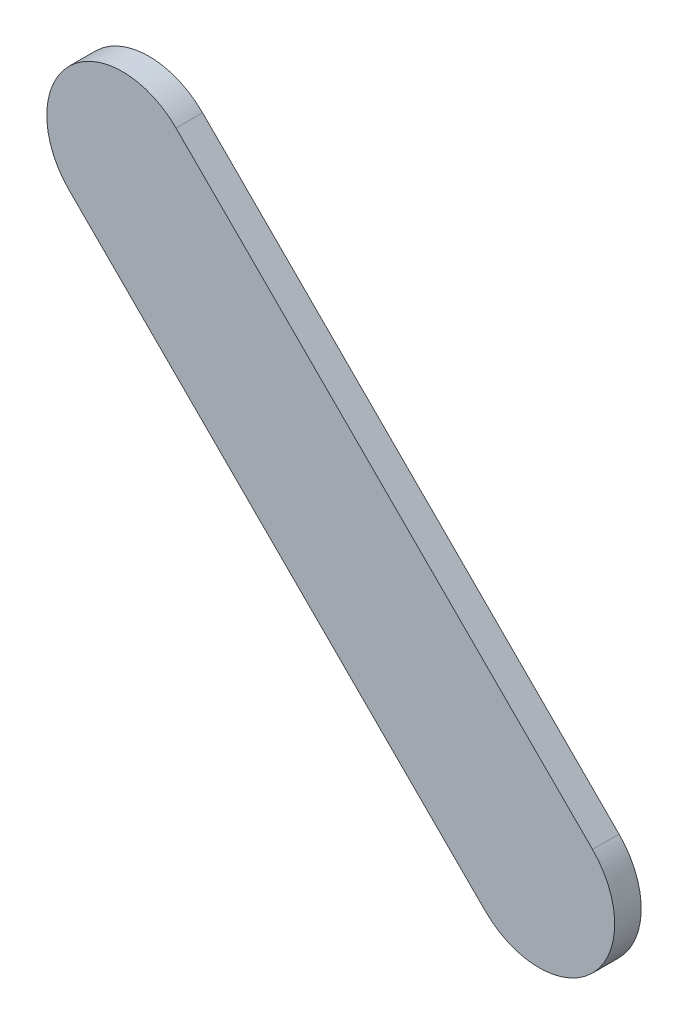
ISO-10303-21;
HEADER;
FILE_DESCRIPTION(('STEP AP214'),'2;1');
FILE_NAME('part.step','',(''),(''),'','','');
FILE_SCHEMA(('AUTOMOTIVE_DESIGN { 1 0 10303 214 1 1 1 1 }'));
ENDSEC;
DATA;
#1=APPLICATION_CONTEXT('core data for automotive mechanical design processes');
#2=APPLICATION_PROTOCOL_DEFINITION('international standard','automotive_design',2000,#1);
#3=PRODUCT_CONTEXT('',#1,'mechanical');
#4=PRODUCT('Part','Part','',(#3));
#5=PRODUCT_RELATED_PRODUCT_CATEGORY('part','',(#4));
#6=PRODUCT_DEFINITION_FORMATION('','',#4);
#7=PRODUCT_DEFINITION_CONTEXT('part definition',#1,'design');
#8=PRODUCT_DEFINITION('design','',#6,#7);
#9=PRODUCT_DEFINITION_SHAPE('','',#8);
#10=(LENGTH_UNIT() NAMED_UNIT(*) SI_UNIT(.MILLI.,.METRE.));
#11=(NAMED_UNIT(*) PLANE_ANGLE_UNIT() SI_UNIT($,.RADIAN.));
#12=(NAMED_UNIT(*) SI_UNIT($,.STERADIAN.) SOLID_ANGLE_UNIT());
#13=UNCERTAINTY_MEASURE_WITH_UNIT(LENGTH_MEASURE(1.E-05),#10,'distance_accuracy_value','');
#14=(GEOMETRIC_REPRESENTATION_CONTEXT(3) GLOBAL_UNCERTAINTY_ASSIGNED_CONTEXT((#13)) GLOBAL_UNIT_ASSIGNED_CONTEXT((#10,
#11,#12)) REPRESENTATION_CONTEXT('',''));
#15=CARTESIAN_POINT('',(0.,0.,0.));
#16=DIRECTION('',(0.,0.,1.));
#17=DIRECTION('',(1.,0.,0.));
#18=AXIS2_PLACEMENT_3D('',#15,#16,#17);
#19=CARTESIAN_POINT('',(79.579289,-119.47071,1.635));
#20=DIRECTION('',(0.,0.,1.));
#21=DIRECTION('',(1.,0.,0.));
#22=AXIS2_PLACEMENT_3D('',#19,#20,#21);
#23=PLANE('',#22);
#24=DIRECTION('',(0.707106781186548,-0.707106781186548,0.));
#25=VECTOR('',#24,1.);
#26=CARTESIAN_POINT('',(79.579289,-119.47071,1.635));
#27=LINE('',#26,#25);
#28=CARTESIAN_POINT('',(79.579289,-119.47071,1.635));
#29=VERTEX_POINT('',#28);
#30=CARTESIAN_POINT('',(80.129289,-120.02071,1.635));
#31=VERTEX_POINT('',#30);
#32=EDGE_CURVE('E77',#29,#31,#27,.T.);
#33=ORIENTED_EDGE('',*,*,#32,.T.);
#34=CARTESIAN_POINT('',(80.1999995,-119.9499995,1.635));
#35=DIRECTION('',(0.,0.,1.));
#36=DIRECTION('',(-0.707106781186048,-0.707106781187048,0.));
#37=AXIS2_PLACEMENT_3D('',#34,#35,#36);
#38=CIRCLE('',#37,0.09999974810218);
#39=CARTESIAN_POINT('',(80.27071,-119.879289,1.635));
#40=VERTEX_POINT('',#39);
#41=EDGE_CURVE('E75',#31,#40,#38,.T.);
#42=ORIENTED_EDGE('',*,*,#41,.T.);
#43=DIRECTION('',(-0.707106781186548,0.707106781186548,0.));
#44=VECTOR('',#43,1.);
#45=CARTESIAN_POINT('',(80.27071,-119.879289,1.635));
#46=LINE('',#45,#44);
#47=CARTESIAN_POINT('',(79.72071,-119.329289,1.635));
#48=VERTEX_POINT('',#47);
#49=EDGE_CURVE('E21',#40,#48,#46,.T.);
#50=ORIENTED_EDGE('',*,*,#49,.T.);
#51=CARTESIAN_POINT('',(79.6499995,-119.3999995,1.635));
#52=DIRECTION('',(0.,0.,1.));
#53=DIRECTION('',(0.707106781186048,0.707106781187048,0.));
#54=AXIS2_PLACEMENT_3D('',#51,#52,#53);
#55=CIRCLE('',#54,0.09999974810218);
#56=EDGE_CURVE('E11',#48,#29,#55,.T.);
#57=ORIENTED_EDGE('',*,*,#56,.T.);
#58=EDGE_LOOP('',(#33,#42,#50,#57));
#59=FACE_BOUND('',#58,.T.);
#60=ADVANCED_FACE('F17',(#59),#23,.T.);
#61=CARTESIAN_POINT('',(79.579289,-119.47071,1.6));
#62=DIRECTION('',(0.,0.,1.));
#63=DIRECTION('',(1.,0.,0.));
#64=AXIS2_PLACEMENT_3D('',#61,#62,#63);
#65=PLANE('',#64);
#66=CARTESIAN_POINT('',(79.6499995,-119.3999995,1.6));
#67=DIRECTION('',(0.,0.,1.));
#68=DIRECTION('',(0.707106781186048,0.707106781187048,0.));
#69=AXIS2_PLACEMENT_3D('',#66,#67,#68);
#70=CIRCLE('',#69,0.09999974810218);
#71=CARTESIAN_POINT('',(79.72071,-119.329289,1.6));
#72=VERTEX_POINT('',#71);
#73=CARTESIAN_POINT('',(79.579289,-119.47071,1.6));
#74=VERTEX_POINT('',#73);
#75=EDGE_CURVE('E28',#72,#74,#70,.T.);
#76=ORIENTED_EDGE('',*,*,#75,.F.);
#77=DIRECTION('',(-0.707106781186548,0.707106781186548,0.));
#78=VECTOR('',#77,1.);
#79=CARTESIAN_POINT('',(80.27071,-119.879289,1.6));
#80=LINE('',#79,#78);
#81=CARTESIAN_POINT('',(80.27071,-119.879289,1.6));
#82=VERTEX_POINT('',#81);
#83=EDGE_CURVE('E57',#82,#72,#80,.T.);
#84=ORIENTED_EDGE('',*,*,#83,.F.);
#85=CARTESIAN_POINT('',(80.1999995,-119.9499995,1.6));
#86=DIRECTION('',(0.,0.,1.));
#87=DIRECTION('',(-0.707106781186048,-0.707106781187048,0.));
#88=AXIS2_PLACEMENT_3D('',#85,#86,#87);
#89=CIRCLE('',#88,0.09999974810218);
#90=CARTESIAN_POINT('',(80.129289,-120.02071,1.6));
#91=VERTEX_POINT('',#90);
#92=EDGE_CURVE('E84',#91,#82,#89,.T.);
#93=ORIENTED_EDGE('',*,*,#92,.F.);
#94=DIRECTION('',(0.707106781186548,-0.707106781186548,0.));
#95=VECTOR('',#94,1.);
#96=CARTESIAN_POINT('',(79.579289,-119.47071,1.6));
#97=LINE('',#96,#95);
#98=EDGE_CURVE('E133',#74,#91,#97,.T.);
#99=ORIENTED_EDGE('',*,*,#98,.F.);
#100=EDGE_LOOP('',(#76,#84,#93,#99));
#101=FACE_BOUND('',#100,.T.);
#102=ADVANCED_FACE('F19',(#101),#65,.F.);
#103=CARTESIAN_POINT('',(79.6499995,-119.3999995,1.6));
#104=DIRECTION('',(0.,0.,-1.));
#105=DIRECTION('',(0.707106781186048,0.707106781187048,0.));
#106=AXIS2_PLACEMENT_3D('',#103,#104,#105);
#107=CYLINDRICAL_SURFACE('',#106,0.09999974810218);
#108=ORIENTED_EDGE('',*,*,#75,.T.);
#109=DIRECTION('',(0.,0.,1.));
#110=VECTOR('',#109,1.);
#111=CARTESIAN_POINT('',(79.579289,-119.47071,1.6));
#112=LINE('',#111,#110);
#113=EDGE_CURVE('E91',#74,#29,#112,.T.);
#114=ORIENTED_EDGE('',*,*,#113,.T.);
#115=ORIENTED_EDGE('',*,*,#56,.F.);
#116=DIRECTION('',(0.,0.,1.));
#117=VECTOR('',#116,1.);
#118=CARTESIAN_POINT('',(79.72071,-119.329289,1.6));
#119=LINE('',#118,#117);
#120=EDGE_CURVE('E70',#72,#48,#119,.T.);
#121=ORIENTED_EDGE('',*,*,#120,.F.);
#122=EDGE_LOOP('',(#108,#114,#115,#121));
#123=FACE_BOUND('',#122,.T.);
#124=ADVANCED_FACE('F155',(#123),#107,.T.);
#125=CARTESIAN_POINT('',(80.27071,-119.879289,1.6));
#126=DIRECTION('',(-0.707106781186548,-0.707106781186548,0.));
#127=DIRECTION('',(-0.707106781186548,0.707106781186548,0.));
#128=AXIS2_PLACEMENT_3D('',#125,#126,#127);
#129=PLANE('',#128);
#130=ORIENTED_EDGE('',*,*,#83,.T.);
#131=ORIENTED_EDGE('',*,*,#120,.T.);
#132=ORIENTED_EDGE('',*,*,#49,.F.);
#133=DIRECTION('',(0.,0.,1.));
#134=VECTOR('',#133,1.);
#135=CARTESIAN_POINT('',(80.27071,-119.879289,1.6));
#136=LINE('',#135,#134);
#137=EDGE_CURVE('E68',#82,#40,#136,.T.);
#138=ORIENTED_EDGE('',*,*,#137,.F.);
#139=EDGE_LOOP('',(#130,#131,#132,#138));
#140=FACE_BOUND('',#139,.T.);
#141=ADVANCED_FACE('F66',(#140),#129,.F.);
#142=CARTESIAN_POINT('',(80.1999995,-119.9499995,1.6));
#143=DIRECTION('',(0.,0.,-1.));
#144=DIRECTION('',(-0.707106781186048,-0.707106781187048,0.));
#145=AXIS2_PLACEMENT_3D('',#142,#143,#144);
#146=CYLINDRICAL_SURFACE('',#145,0.09999974810218);
#147=ORIENTED_EDGE('',*,*,#92,.T.);
#148=ORIENTED_EDGE('',*,*,#137,.T.);
#149=ORIENTED_EDGE('',*,*,#41,.F.);
#150=DIRECTION('',(0.,0.,1.));
#151=VECTOR('',#150,1.);
#152=CARTESIAN_POINT('',(80.129289,-120.02071,1.6));
#153=LINE('',#152,#151);
#154=EDGE_CURVE('E95',#91,#31,#153,.T.);
#155=ORIENTED_EDGE('',*,*,#154,.F.);
#156=EDGE_LOOP('',(#147,#148,#149,#155));
#157=FACE_BOUND('',#156,.T.);
#158=ADVANCED_FACE('F83',(#157),#146,.T.);
#159=CARTESIAN_POINT('',(79.579289,-119.47071,1.6));
#160=DIRECTION('',(0.707106781186548,0.707106781186548,0.));
#161=DIRECTION('',(0.,0.,-1.));
#162=AXIS2_PLACEMENT_3D('',#159,#160,#161);
#163=PLANE('',#162);
#164=ORIENTED_EDGE('',*,*,#98,.T.);
#165=ORIENTED_EDGE('',*,*,#154,.T.);
#166=ORIENTED_EDGE('',*,*,#32,.F.);
#167=ORIENTED_EDGE('',*,*,#113,.F.);
#168=EDGE_LOOP('',(#164,#165,#166,#167));
#169=FACE_BOUND('',#168,.T.);
#170=ADVANCED_FACE('F148',(#169),#163,.F.);
#171=CLOSED_SHELL('',(#60,#102,#124,#141,#158,#170));
#172=MANIFOLD_SOLID_BREP('B1',#171);
#173=ADVANCED_BREP_SHAPE_REPRESENTATION('',(#18,#172),#14);
#174=SHAPE_DEFINITION_REPRESENTATION(#9,#173);
ENDSEC;
END-ISO-10303-21;
